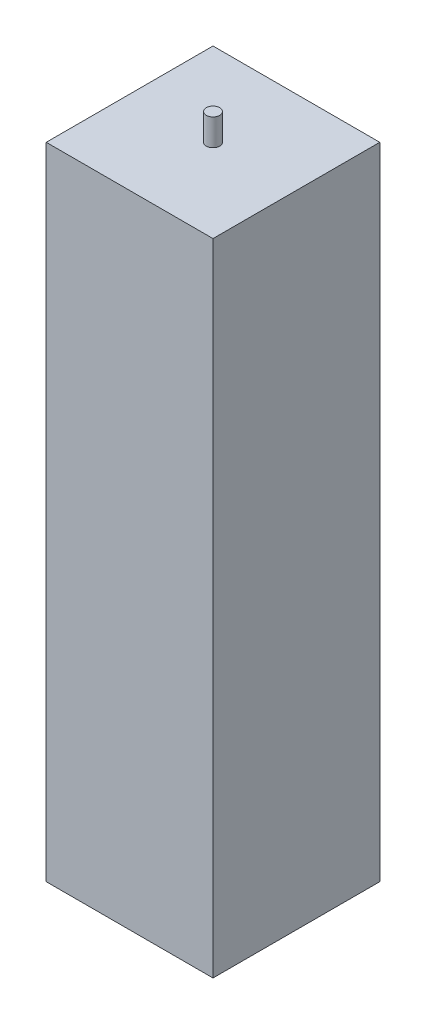
ISO-10303-21;
HEADER;
FILE_DESCRIPTION(('STEP AP214'),'2;1');
FILE_NAME('part.step','',(''),(''),'','','');
FILE_SCHEMA(('AUTOMOTIVE_DESIGN { 1 0 10303 214 1 1 1 1 }'));
ENDSEC;
DATA;
#1=APPLICATION_CONTEXT('core data for automotive mechanical design processes');
#2=APPLICATION_PROTOCOL_DEFINITION('international standard','automotive_design',2000,#1);
#3=PRODUCT_CONTEXT('',#1,'mechanical');
#4=PRODUCT('Part','Part','',(#3));
#5=PRODUCT_RELATED_PRODUCT_CATEGORY('part','',(#4));
#6=PRODUCT_DEFINITION_FORMATION('','',#4);
#7=PRODUCT_DEFINITION_CONTEXT('part definition',#1,'design');
#8=PRODUCT_DEFINITION('design','',#6,#7);
#9=PRODUCT_DEFINITION_SHAPE('','',#8);
#10=(LENGTH_UNIT() NAMED_UNIT(*) SI_UNIT(.MILLI.,.METRE.));
#11=(NAMED_UNIT(*) PLANE_ANGLE_UNIT() SI_UNIT($,.RADIAN.));
#12=(NAMED_UNIT(*) SI_UNIT($,.STERADIAN.) SOLID_ANGLE_UNIT());
#13=UNCERTAINTY_MEASURE_WITH_UNIT(LENGTH_MEASURE(1.E-05),#10,'distance_accuracy_value','');
#14=(GEOMETRIC_REPRESENTATION_CONTEXT(3) GLOBAL_UNCERTAINTY_ASSIGNED_CONTEXT((#13)) GLOBAL_UNIT_ASSIGNED_CONTEXT((#10,
#11,#12)) REPRESENTATION_CONTEXT('',''));
#15=CARTESIAN_POINT('',(0.,0.,0.));
#16=DIRECTION('',(0.,0.,1.));
#17=DIRECTION('',(1.,0.,0.));
#18=AXIS2_PLACEMENT_3D('',#15,#16,#17);
#19=CARTESIAN_POINT('',(-6.25000000000001,24.,12.5));
#20=DIRECTION('',(1.,0.,0.));
#21=DIRECTION('',(0.,1.,0.));
#22=AXIS2_PLACEMENT_3D('',#19,#20,#21);
#23=PLANE('',#22);
#24=DIRECTION('',(0.,-1.,0.));
#25=VECTOR('',#24,1.);
#26=CARTESIAN_POINT('',(-6.25000000000001,24.,0.));
#27=LINE('',#26,#25);
#28=CARTESIAN_POINT('',(-6.25000000000001,24.,0.));
#29=VERTEX_POINT('',#28);
#30=CARTESIAN_POINT('',(-6.25,-24.,0.));
#31=VERTEX_POINT('',#30);
#32=EDGE_CURVE('E98',#29,#31,#27,.T.);
#33=ORIENTED_EDGE('',*,*,#32,.T.);
#34=DIRECTION('',(0.,0.,-1.));
#35=VECTOR('',#34,1.);
#36=CARTESIAN_POINT('',(-6.25,-24.,12.5));
#37=LINE('',#36,#35);
#38=CARTESIAN_POINT('',(-6.25,-24.,12.5));
#39=VERTEX_POINT('',#38);
#40=EDGE_CURVE('E11',#39,#31,#37,.T.);
#41=ORIENTED_EDGE('',*,*,#40,.F.);
#42=DIRECTION('',(0.,-1.,0.));
#43=VECTOR('',#42,1.);
#44=CARTESIAN_POINT('',(-6.25000000000001,24.,12.5));
#45=LINE('',#44,#43);
#46=CARTESIAN_POINT('',(-6.25000000000001,24.,12.5));
#47=VERTEX_POINT('',#46);
#48=EDGE_CURVE('E85',#47,#39,#45,.T.);
#49=ORIENTED_EDGE('',*,*,#48,.F.);
#50=DIRECTION('',(0.,0.,-1.));
#51=VECTOR('',#50,1.);
#52=CARTESIAN_POINT('',(-6.25000000000001,24.,12.5));
#53=LINE('',#52,#51);
#54=EDGE_CURVE('E94',#47,#29,#53,.T.);
#55=ORIENTED_EDGE('',*,*,#54,.T.);
#56=EDGE_LOOP('',(#33,#41,#49,#55));
#57=FACE_BOUND('',#56,.T.);
#58=ADVANCED_FACE('F33',(#57),#23,.F.);
#59=CARTESIAN_POINT('',(-6.25,-24.,12.5));
#60=DIRECTION('',(0.,1.,0.));
#61=DIRECTION('',(0.,0.,1.));
#62=AXIS2_PLACEMENT_3D('',#59,#60,#61);
#63=PLANE('',#62);
#64=CARTESIAN_POINT('',(0.,-24.,6.25));
#65=DIRECTION('',(0.,1.,0.));
#66=DIRECTION('',(0.,0.,1.));
#67=AXIS2_PLACEMENT_3D('',#64,#65,#66);
#68=CIRCLE('',#67,0.500000000000001);
#69=CARTESIAN_POINT('',(0.,-24.,6.75));
#70=VERTEX_POINT('',#69);
#71=EDGE_CURVE('E101',#70,#70,#68,.T.);
#72=ORIENTED_EDGE('',*,*,#71,.T.);
#73=EDGE_LOOP('',(#72));
#74=FACE_BOUND('',#73,.T.);
#75=DIRECTION('',(1.,0.,0.));
#76=VECTOR('',#75,1.);
#77=CARTESIAN_POINT('',(-6.25,-24.,0.));
#78=LINE('',#77,#76);
#79=CARTESIAN_POINT('',(6.25,-24.,0.));
#80=VERTEX_POINT('',#79);
#81=EDGE_CURVE('E89',#31,#80,#78,.T.);
#82=ORIENTED_EDGE('',*,*,#81,.T.);
#83=DIRECTION('',(0.,0.,-1.));
#84=VECTOR('',#83,1.);
#85=CARTESIAN_POINT('',(6.25,-24.,12.5));
#86=LINE('',#85,#84);
#87=CARTESIAN_POINT('',(6.25,-24.,12.5));
#88=VERTEX_POINT('',#87);
#89=EDGE_CURVE('E42',#88,#80,#86,.T.);
#90=ORIENTED_EDGE('',*,*,#89,.F.);
#91=DIRECTION('',(1.,0.,0.));
#92=VECTOR('',#91,1.);
#93=CARTESIAN_POINT('',(-6.25,-24.,12.5));
#94=LINE('',#93,#92);
#95=EDGE_CURVE('E80',#39,#88,#94,.T.);
#96=ORIENTED_EDGE('',*,*,#95,.F.);
#97=ORIENTED_EDGE('',*,*,#40,.T.);
#98=EDGE_LOOP('',(#82,#90,#96,#97));
#99=FACE_BOUND('',#98,.T.);
#100=ADVANCED_FACE('F88',(#74,#99),#63,.F.);
#101=CARTESIAN_POINT('',(6.25000000000002,24.,12.5));
#102=DIRECTION('',(-1.,0.,0.));
#103=DIRECTION('',(0.,-1.,0.));
#104=AXIS2_PLACEMENT_3D('',#101,#102,#103);
#105=PLANE('',#104);
#106=DIRECTION('',(0.,1.,0.));
#107=VECTOR('',#106,1.);
#108=CARTESIAN_POINT('',(6.25000000000002,24.,0.));
#109=LINE('',#108,#107);
#110=CARTESIAN_POINT('',(6.25000000000002,24.,0.));
#111=VERTEX_POINT('',#110);
#112=EDGE_CURVE('E67',#80,#111,#109,.T.);
#113=ORIENTED_EDGE('',*,*,#112,.T.);
#114=DIRECTION('',(0.,0.,-1.));
#115=VECTOR('',#114,1.);
#116=CARTESIAN_POINT('',(6.25000000000002,24.,12.5));
#117=LINE('',#116,#115);
#118=CARTESIAN_POINT('',(6.25000000000002,24.,12.5));
#119=VERTEX_POINT('',#118);
#120=EDGE_CURVE('E90',#119,#111,#117,.T.);
#121=ORIENTED_EDGE('',*,*,#120,.F.);
#122=DIRECTION('',(0.,1.,0.));
#123=VECTOR('',#122,1.);
#124=CARTESIAN_POINT('',(6.25000000000002,24.,12.5));
#125=LINE('',#124,#123);
#126=EDGE_CURVE('E83',#88,#119,#125,.T.);
#127=ORIENTED_EDGE('',*,*,#126,.F.);
#128=ORIENTED_EDGE('',*,*,#89,.T.);
#129=EDGE_LOOP('',(#113,#121,#127,#128));
#130=FACE_BOUND('',#129,.T.);
#131=ADVANCED_FACE('F92',(#130),#105,.F.);
#132=CARTESIAN_POINT('',(-6.25000000000001,24.,12.5));
#133=DIRECTION('',(0.,-1.,0.));
#134=DIRECTION('',(0.,0.,-1.));
#135=AXIS2_PLACEMENT_3D('',#132,#133,#134);
#136=PLANE('',#135);
#137=CARTESIAN_POINT('',(0.,24.,6.25));
#138=DIRECTION('',(0.,-1.,0.));
#139=DIRECTION('',(0.,0.,-1.));
#140=AXIS2_PLACEMENT_3D('',#137,#138,#139);
#141=CIRCLE('',#140,0.500000000000001);
#142=CARTESIAN_POINT('',(0.,24.,5.75));
#143=VERTEX_POINT('',#142);
#144=EDGE_CURVE('E36',#143,#143,#141,.T.);
#145=ORIENTED_EDGE('',*,*,#144,.T.);
#146=EDGE_LOOP('',(#145));
#147=FACE_BOUND('',#146,.T.);
#148=DIRECTION('',(-1.,0.,0.));
#149=VECTOR('',#148,1.);
#150=CARTESIAN_POINT('',(-6.25000000000001,24.,0.));
#151=LINE('',#150,#149);
#152=EDGE_CURVE('E73',#111,#29,#151,.T.);
#153=ORIENTED_EDGE('',*,*,#152,.T.);
#154=ORIENTED_EDGE('',*,*,#54,.F.);
#155=DIRECTION('',(-1.,0.,0.));
#156=VECTOR('',#155,1.);
#157=CARTESIAN_POINT('',(-6.25000000000001,24.,12.5));
#158=LINE('',#157,#156);
#159=EDGE_CURVE('E50',#119,#47,#158,.T.);
#160=ORIENTED_EDGE('',*,*,#159,.F.);
#161=ORIENTED_EDGE('',*,*,#120,.T.);
#162=EDGE_LOOP('',(#153,#154,#160,#161));
#163=FACE_BOUND('',#162,.T.);
#164=ADVANCED_FACE('F106',(#147,#163),#136,.F.);
#165=CARTESIAN_POINT('',(0.,0.,12.5));
#166=DIRECTION('',(0.,0.,1.));
#167=DIRECTION('',(1.,0.,0.));
#168=AXIS2_PLACEMENT_3D('',#165,#166,#167);
#169=PLANE('',#168);
#170=ORIENTED_EDGE('',*,*,#48,.T.);
#171=ORIENTED_EDGE('',*,*,#95,.T.);
#172=ORIENTED_EDGE('',*,*,#126,.T.);
#173=ORIENTED_EDGE('',*,*,#159,.T.);
#174=EDGE_LOOP('',(#170,#171,#172,#173));
#175=FACE_BOUND('',#174,.T.);
#176=ADVANCED_FACE('F81',(#175),#169,.T.);
#177=CARTESIAN_POINT('',(0.,0.,0.));
#178=DIRECTION('',(0.,0.,1.));
#179=DIRECTION('',(1.,0.,0.));
#180=AXIS2_PLACEMENT_3D('',#177,#178,#179);
#181=PLANE('',#180);
#182=ORIENTED_EDGE('',*,*,#32,.F.);
#183=ORIENTED_EDGE('',*,*,#152,.F.);
#184=ORIENTED_EDGE('',*,*,#112,.F.);
#185=ORIENTED_EDGE('',*,*,#81,.F.);
#186=EDGE_LOOP('',(#182,#183,#184,#185));
#187=FACE_BOUND('',#186,.T.);
#188=ADVANCED_FACE('F109',(#187),#181,.F.);
#189=CARTESIAN_POINT('',(0.,26.,6.25));
#190=DIRECTION('',(0.,1.,0.));
#191=DIRECTION('',(0.,0.,1.));
#192=AXIS2_PLACEMENT_3D('',#189,#190,#191);
#193=PLANE('',#192);
#194=CARTESIAN_POINT('',(0.,26.,6.25));
#195=DIRECTION('',(0.,1.,0.));
#196=DIRECTION('',(0.,0.,1.));
#197=AXIS2_PLACEMENT_3D('',#194,#195,#196);
#198=CIRCLE('',#197,0.500000000000001);
#199=CARTESIAN_POINT('',(0.,26.,6.75));
#200=VERTEX_POINT('',#199);
#201=EDGE_CURVE('E117',#200,#200,#198,.T.);
#202=ORIENTED_EDGE('',*,*,#201,.T.);
#203=EDGE_LOOP('',(#202));
#204=FACE_BOUND('',#203,.T.);
#205=ADVANCED_FACE('F121',(#204),#193,.T.);
#206=CARTESIAN_POINT('',(0.,-25.5,6.25));
#207=DIRECTION('',(0.,1.,0.));
#208=DIRECTION('',(0.,0.,1.));
#209=AXIS2_PLACEMENT_3D('',#206,#207,#208);
#210=CYLINDRICAL_SURFACE('',#209,0.500000000000001);
#211=ORIENTED_EDGE('',*,*,#201,.F.);
#212=EDGE_LOOP('',(#211));
#213=FACE_BOUND('',#212,.T.);
#214=ORIENTED_EDGE('',*,*,#144,.F.);
#215=EDGE_LOOP('',(#214));
#216=FACE_BOUND('',#215,.T.);
#217=ADVANCED_FACE('F123',(#213,#216),#210,.T.);
#218=CARTESIAN_POINT('',(0.,-25.5,6.25));
#219=DIRECTION('',(0.,1.,0.));
#220=DIRECTION('',(0.,0.,1.));
#221=AXIS2_PLACEMENT_3D('',#218,#219,#220);
#222=CIRCLE('',#221,0.500000000000001);
#223=CARTESIAN_POINT('',(0.,-25.5,6.75));
#224=VERTEX_POINT('',#223);
#225=EDGE_CURVE('E114',#224,#224,#222,.T.);
#226=ORIENTED_EDGE('',*,*,#225,.T.);
#227=EDGE_LOOP('',(#226));
#228=FACE_BOUND('',#227,.T.);
#229=ORIENTED_EDGE('',*,*,#71,.F.);
#230=EDGE_LOOP('',(#229));
#231=FACE_BOUND('',#230,.T.);
#232=ADVANCED_FACE('F126',(#228,#231),#210,.T.);
#233=CARTESIAN_POINT('',(0.,-25.5,6.25));
#234=DIRECTION('',(0.,1.,0.));
#235=DIRECTION('',(0.,0.,1.));
#236=AXIS2_PLACEMENT_3D('',#233,#234,#235);
#237=PLANE('',#236);
#238=ORIENTED_EDGE('',*,*,#225,.F.);
#239=EDGE_LOOP('',(#238));
#240=FACE_BOUND('',#239,.T.);
#241=ADVANCED_FACE('F152',(#240),#237,.F.);
#242=CLOSED_SHELL('',(#58,#100,#131,#164,#176,#188,#205,#217,#232,#241));
#243=MANIFOLD_SOLID_BREP('B2',#242);
#244=ADVANCED_BREP_SHAPE_REPRESENTATION('',(#18,#243),#14);
#245=SHAPE_DEFINITION_REPRESENTATION(#9,#244);
ENDSEC;
END-ISO-10303-21;
